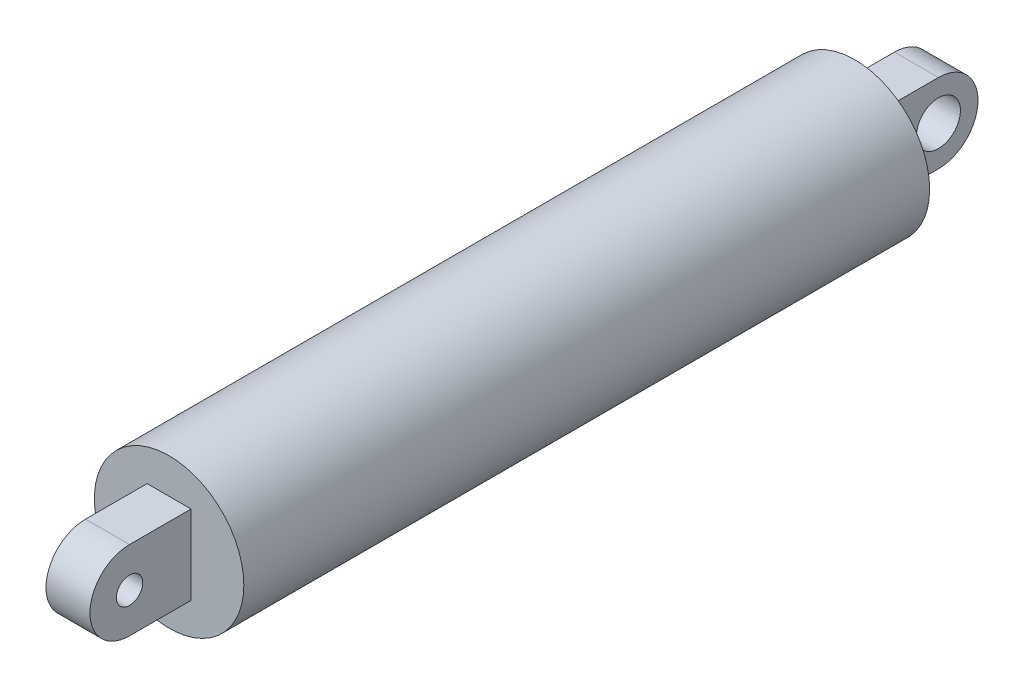
ISO-10303-21;
HEADER;
FILE_DESCRIPTION(('STEP AP214'),'2;1');
FILE_NAME('part.step','',(''),(''),'','','');
FILE_SCHEMA(('AUTOMOTIVE_DESIGN { 1 0 10303 214 1 1 1 1 }'));
ENDSEC;
DATA;
#1=APPLICATION_CONTEXT('core data for automotive mechanical design processes');
#2=APPLICATION_PROTOCOL_DEFINITION('international standard','automotive_design',2000,#1);
#3=PRODUCT_CONTEXT('',#1,'mechanical');
#4=PRODUCT('Part','Part','',(#3));
#5=PRODUCT_RELATED_PRODUCT_CATEGORY('part','',(#4));
#6=PRODUCT_DEFINITION_FORMATION('','',#4);
#7=PRODUCT_DEFINITION_CONTEXT('part definition',#1,'design');
#8=PRODUCT_DEFINITION('design','',#6,#7);
#9=PRODUCT_DEFINITION_SHAPE('','',#8);
#10=(LENGTH_UNIT() NAMED_UNIT(*) SI_UNIT(.MILLI.,.METRE.));
#11=(NAMED_UNIT(*) PLANE_ANGLE_UNIT() SI_UNIT($,.RADIAN.));
#12=(NAMED_UNIT(*) SI_UNIT($,.STERADIAN.) SOLID_ANGLE_UNIT());
#13=UNCERTAINTY_MEASURE_WITH_UNIT(LENGTH_MEASURE(1.E-05),#10,'distance_accuracy_value','');
#14=(GEOMETRIC_REPRESENTATION_CONTEXT(3) GLOBAL_UNCERTAINTY_ASSIGNED_CONTEXT((#13)) GLOBAL_UNIT_ASSIGNED_CONTEXT((#10,
#11,#12)) REPRESENTATION_CONTEXT('',''));
#15=CARTESIAN_POINT('',(0.,0.,0.));
#16=DIRECTION('',(0.,0.,1.));
#17=DIRECTION('',(1.,0.,0.));
#18=AXIS2_PLACEMENT_3D('',#15,#16,#17);
#19=CARTESIAN_POINT('',(0.,0.,0.));
#20=DIRECTION('',(0.,0.,-1.));
#21=DIRECTION('',(-1.,0.,0.));
#22=AXIS2_PLACEMENT_3D('',#19,#20,#21);
#23=PLANE('',#22);
#24=DIRECTION('',(-1.,0.,0.));
#25=VECTOR('',#24,1.);
#26=CARTESIAN_POINT('',(2.5,-4.5,0.));
#27=LINE('',#26,#25);
#28=CARTESIAN_POINT('',(2.5,-4.5,0.));
#29=VERTEX_POINT('',#28);
#30=CARTESIAN_POINT('',(-2.5,-4.5,0.));
#31=VERTEX_POINT('',#30);
#32=EDGE_CURVE('E181',#29,#31,#27,.T.);
#33=ORIENTED_EDGE('',*,*,#32,.T.);
#34=DIRECTION('',(0.,1.,0.));
#35=VECTOR('',#34,1.);
#36=CARTESIAN_POINT('',(-2.5,4.5,0.));
#37=LINE('',#36,#35);
#38=CARTESIAN_POINT('',(-2.5,4.5,0.));
#39=VERTEX_POINT('',#38);
#40=EDGE_CURVE('E62',#31,#39,#37,.T.);
#41=ORIENTED_EDGE('',*,*,#40,.T.);
#42=DIRECTION('',(-1.,0.,0.));
#43=VECTOR('',#42,1.);
#44=CARTESIAN_POINT('',(2.5,4.5,0.));
#45=LINE('',#44,#43);
#46=CARTESIAN_POINT('',(2.5,4.5,0.));
#47=VERTEX_POINT('',#46);
#48=EDGE_CURVE('E178',#47,#39,#45,.T.);
#49=ORIENTED_EDGE('',*,*,#48,.F.);
#50=DIRECTION('',(0.,1.,0.));
#51=VECTOR('',#50,1.);
#52=CARTESIAN_POINT('',(2.5,4.5,0.));
#53=LINE('',#52,#51);
#54=EDGE_CURVE('E158',#29,#47,#53,.T.);
#55=ORIENTED_EDGE('',*,*,#54,.F.);
#56=EDGE_LOOP('',(#33,#41,#49,#55));
#57=FACE_BOUND('',#56,.T.);
#58=CARTESIAN_POINT('',(0.,0.,0.));
#59=DIRECTION('',(0.,0.,1.));
#60=DIRECTION('',(1.,0.,0.));
#61=AXIS2_PLACEMENT_3D('',#58,#59,#60);
#62=CIRCLE('',#61,8.5);
#63=CARTESIAN_POINT('',(8.5,0.,0.));
#64=VERTEX_POINT('',#63);
#65=EDGE_CURVE('E11',#64,#64,#62,.T.);
#66=ORIENTED_EDGE('',*,*,#65,.T.);
#67=EDGE_LOOP('',(#66));
#68=FACE_BOUND('',#67,.T.);
#69=ADVANCED_FACE('F39',(#57,#68),#23,.F.);
#70=CARTESIAN_POINT('',(0.,0.,27.6694587725101));
#71=DIRECTION('',(0.,0.,1.));
#72=DIRECTION('',(1.,0.,0.));
#73=AXIS2_PLACEMENT_3D('',#70,#71,#72);
#74=CYLINDRICAL_SURFACE('',#73,8.5);
#75=ORIENTED_EDGE('',*,*,#65,.F.);
#76=EDGE_LOOP('',(#75));
#77=FACE_BOUND('',#76,.T.);
#78=CARTESIAN_POINT('',(0.,0.,-78.));
#79=DIRECTION('',(0.,0.,1.));
#80=DIRECTION('',(1.,0.,0.));
#81=AXIS2_PLACEMENT_3D('',#78,#79,#80);
#82=CIRCLE('',#81,8.5);
#83=CARTESIAN_POINT('',(8.5,0.,-78.));
#84=VERTEX_POINT('',#83);
#85=EDGE_CURVE('E47',#84,#84,#82,.T.);
#86=ORIENTED_EDGE('',*,*,#85,.T.);
#87=EDGE_LOOP('',(#86));
#88=FACE_BOUND('',#87,.T.);
#89=ADVANCED_FACE('F192',(#77,#88),#74,.T.);
#90=CARTESIAN_POINT('',(0.,8.5,-78.));
#91=DIRECTION('',(0.,0.,1.));
#92=DIRECTION('',(1.,0.,0.));
#93=AXIS2_PLACEMENT_3D('',#90,#91,#92);
#94=PLANE('',#93);
#95=DIRECTION('',(-1.,0.,0.));
#96=VECTOR('',#95,1.);
#97=CARTESIAN_POINT('',(2.5,4.5,-78.));
#98=LINE('',#97,#96);
#99=CARTESIAN_POINT('',(2.5,4.5,-78.));
#100=VERTEX_POINT('',#99);
#101=CARTESIAN_POINT('',(-2.5,4.5,-78.));
#102=VERTEX_POINT('',#101);
#103=EDGE_CURVE('E113',#100,#102,#98,.T.);
#104=ORIENTED_EDGE('',*,*,#103,.T.);
#105=DIRECTION('',(0.,-1.,0.));
#106=VECTOR('',#105,1.);
#107=CARTESIAN_POINT('',(-2.5,4.5,-78.));
#108=LINE('',#107,#106);
#109=CARTESIAN_POINT('',(-2.5,-4.5,-78.));
#110=VERTEX_POINT('',#109);
#111=EDGE_CURVE('E54',#102,#110,#108,.T.);
#112=ORIENTED_EDGE('',*,*,#111,.T.);
#113=DIRECTION('',(-1.,0.,0.));
#114=VECTOR('',#113,1.);
#115=CARTESIAN_POINT('',(2.5,-4.5,-78.));
#116=LINE('',#115,#114);
#117=CARTESIAN_POINT('',(2.5,-4.5,-78.));
#118=VERTEX_POINT('',#117);
#119=EDGE_CURVE('E142',#118,#110,#116,.T.);
#120=ORIENTED_EDGE('',*,*,#119,.F.);
#121=DIRECTION('',(0.,-1.,0.));
#122=VECTOR('',#121,1.);
#123=CARTESIAN_POINT('',(2.5,4.5,-78.));
#124=LINE('',#123,#122);
#125=EDGE_CURVE('E117',#100,#118,#124,.T.);
#126=ORIENTED_EDGE('',*,*,#125,.F.);
#127=EDGE_LOOP('',(#104,#112,#120,#126));
#128=FACE_BOUND('',#127,.T.);
#129=ORIENTED_EDGE('',*,*,#85,.F.);
#130=EDGE_LOOP('',(#129));
#131=FACE_BOUND('',#130,.T.);
#132=ADVANCED_FACE('F194',(#128,#131),#94,.F.);
#133=CARTESIAN_POINT('',(2.5,0.,7.));
#134=DIRECTION('',(1.,0.,0.));
#135=DIRECTION('',(0.,0.,-1.));
#136=AXIS2_PLACEMENT_3D('',#133,#134,#135);
#137=PLANE('',#136);
#138=CARTESIAN_POINT('',(2.5,0.,7.));
#139=DIRECTION('',(1.,0.,0.));
#140=DIRECTION('',(0.,0.,-1.));
#141=AXIS2_PLACEMENT_3D('',#138,#139,#140);
#142=CIRCLE('',#141,4.5);
#143=CARTESIAN_POINT('',(2.5,4.5,7.));
#144=VERTEX_POINT('',#143);
#145=CARTESIAN_POINT('',(2.5,-4.5,7.));
#146=VERTEX_POINT('',#145);
#147=EDGE_CURVE('E150',#144,#146,#142,.T.);
#148=ORIENTED_EDGE('',*,*,#147,.T.);
#149=DIRECTION('',(0.,0.,-1.));
#150=VECTOR('',#149,1.);
#151=CARTESIAN_POINT('',(2.5,-4.5,7.));
#152=LINE('',#151,#150);
#153=EDGE_CURVE('E154',#146,#29,#152,.T.);
#154=ORIENTED_EDGE('',*,*,#153,.T.);
#155=ORIENTED_EDGE('',*,*,#54,.T.);
#156=DIRECTION('',(0.,0.,1.));
#157=VECTOR('',#156,1.);
#158=CARTESIAN_POINT('',(2.5,4.5,7.));
#159=LINE('',#158,#157);
#160=EDGE_CURVE('E161',#47,#144,#159,.T.);
#161=ORIENTED_EDGE('',*,*,#160,.T.);
#162=EDGE_LOOP('',(#148,#154,#155,#161));
#163=FACE_BOUND('',#162,.T.);
#164=CARTESIAN_POINT('',(2.5,0.,7.));
#165=DIRECTION('',(1.,0.,0.));
#166=DIRECTION('',(0.,0.,-1.));
#167=AXIS2_PLACEMENT_3D('',#164,#165,#166);
#168=CIRCLE('',#167,1.5);
#169=CARTESIAN_POINT('',(2.5,0.,5.5));
#170=VERTEX_POINT('',#169);
#171=EDGE_CURVE('E140',#170,#170,#168,.T.);
#172=ORIENTED_EDGE('',*,*,#171,.F.);
#173=EDGE_LOOP('',(#172));
#174=FACE_BOUND('',#173,.T.);
#175=ADVANCED_FACE('F196',(#163,#174),#137,.T.);
#176=CARTESIAN_POINT('',(-2.5,0.,7.));
#177=DIRECTION('',(1.,0.,0.));
#178=DIRECTION('',(0.,0.,-1.));
#179=AXIS2_PLACEMENT_3D('',#176,#177,#178);
#180=PLANE('',#179);
#181=CARTESIAN_POINT('',(-2.5,0.,7.));
#182=DIRECTION('',(1.,0.,0.));
#183=DIRECTION('',(0.,0.,-1.));
#184=AXIS2_PLACEMENT_3D('',#181,#182,#183);
#185=CIRCLE('',#184,4.5);
#186=CARTESIAN_POINT('',(-2.5,4.5,7.));
#187=VERTEX_POINT('',#186);
#188=CARTESIAN_POINT('',(-2.5,-4.5,7.));
#189=VERTEX_POINT('',#188);
#190=EDGE_CURVE('E148',#187,#189,#185,.T.);
#191=ORIENTED_EDGE('',*,*,#190,.F.);
#192=DIRECTION('',(0.,0.,1.));
#193=VECTOR('',#192,1.);
#194=CARTESIAN_POINT('',(-2.5,4.5,7.));
#195=LINE('',#194,#193);
#196=EDGE_CURVE('E155',#39,#187,#195,.T.);
#197=ORIENTED_EDGE('',*,*,#196,.F.);
#198=ORIENTED_EDGE('',*,*,#40,.F.);
#199=DIRECTION('',(0.,0.,-1.));
#200=VECTOR('',#199,1.);
#201=CARTESIAN_POINT('',(-2.5,-4.5,7.));
#202=LINE('',#201,#200);
#203=EDGE_CURVE('E168',#189,#31,#202,.T.);
#204=ORIENTED_EDGE('',*,*,#203,.F.);
#205=EDGE_LOOP('',(#191,#197,#198,#204));
#206=FACE_BOUND('',#205,.T.);
#207=CARTESIAN_POINT('',(-2.5,0.,7.));
#208=DIRECTION('',(1.,0.,0.));
#209=DIRECTION('',(0.,0.,-1.));
#210=AXIS2_PLACEMENT_3D('',#207,#208,#209);
#211=CIRCLE('',#210,1.5);
#212=CARTESIAN_POINT('',(-2.5,0.,5.5));
#213=VERTEX_POINT('',#212);
#214=EDGE_CURVE('E135',#213,#213,#211,.T.);
#215=ORIENTED_EDGE('',*,*,#214,.T.);
#216=EDGE_LOOP('',(#215));
#217=FACE_BOUND('',#216,.T.);
#218=ADVANCED_FACE('F203',(#206,#217),#180,.F.);
#219=CARTESIAN_POINT('',(2.5,0.,7.));
#220=DIRECTION('',(-1.,0.,0.));
#221=DIRECTION('',(0.,0.,1.));
#222=AXIS2_PLACEMENT_3D('',#219,#220,#221);
#223=CYLINDRICAL_SURFACE('',#222,4.5);
#224=ORIENTED_EDGE('',*,*,#190,.T.);
#225=DIRECTION('',(-1.,0.,0.));
#226=VECTOR('',#225,1.);
#227=CARTESIAN_POINT('',(2.5,-4.5,7.));
#228=LINE('',#227,#226);
#229=EDGE_CURVE('E185',#146,#189,#228,.T.);
#230=ORIENTED_EDGE('',*,*,#229,.F.);
#231=ORIENTED_EDGE('',*,*,#147,.F.);
#232=DIRECTION('',(-1.,0.,0.));
#233=VECTOR('',#232,1.);
#234=CARTESIAN_POINT('',(2.5,4.5,7.));
#235=LINE('',#234,#233);
#236=EDGE_CURVE('E164',#144,#187,#235,.T.);
#237=ORIENTED_EDGE('',*,*,#236,.T.);
#238=EDGE_LOOP('',(#224,#230,#231,#237));
#239=FACE_BOUND('',#238,.T.);
#240=ADVANCED_FACE('F223',(#239),#223,.T.);
#241=CARTESIAN_POINT('',(2.5,-4.5,7.));
#242=DIRECTION('',(0.,1.,0.));
#243=DIRECTION('',(0.,0.,1.));
#244=AXIS2_PLACEMENT_3D('',#241,#242,#243);
#245=PLANE('',#244);
#246=ORIENTED_EDGE('',*,*,#203,.T.);
#247=ORIENTED_EDGE('',*,*,#32,.F.);
#248=ORIENTED_EDGE('',*,*,#153,.F.);
#249=ORIENTED_EDGE('',*,*,#229,.T.);
#250=EDGE_LOOP('',(#246,#247,#248,#249));
#251=FACE_BOUND('',#250,.T.);
#252=ADVANCED_FACE('F218',(#251),#245,.F.);
#253=CARTESIAN_POINT('',(2.5,4.5,7.));
#254=DIRECTION('',(0.,-1.,0.));
#255=DIRECTION('',(0.,0.,-1.));
#256=AXIS2_PLACEMENT_3D('',#253,#254,#255);
#257=PLANE('',#256);
#258=ORIENTED_EDGE('',*,*,#196,.T.);
#259=ORIENTED_EDGE('',*,*,#236,.F.);
#260=ORIENTED_EDGE('',*,*,#160,.F.);
#261=ORIENTED_EDGE('',*,*,#48,.T.);
#262=EDGE_LOOP('',(#258,#259,#260,#261));
#263=FACE_BOUND('',#262,.T.);
#264=ADVANCED_FACE('F228',(#263),#257,.F.);
#265=CARTESIAN_POINT('',(2.5,0.,7.));
#266=DIRECTION('',(-1.,0.,0.));
#267=DIRECTION('',(0.,0.,1.));
#268=AXIS2_PLACEMENT_3D('',#265,#266,#267);
#269=CYLINDRICAL_SURFACE('',#268,1.5);
#270=ORIENTED_EDGE('',*,*,#171,.T.);
#271=EDGE_LOOP('',(#270));
#272=FACE_BOUND('',#271,.T.);
#273=ORIENTED_EDGE('',*,*,#214,.F.);
#274=EDGE_LOOP('',(#273));
#275=FACE_BOUND('',#274,.T.);
#276=ADVANCED_FACE('F232',(#272,#275),#269,.F.);
#277=CARTESIAN_POINT('',(2.5,0.,-85.));
#278=DIRECTION('',(1.,0.,0.));
#279=DIRECTION('',(0.,0.,-1.));
#280=AXIS2_PLACEMENT_3D('',#277,#278,#279);
#281=PLANE('',#280);
#282=CARTESIAN_POINT('',(2.5,0.,-85.));
#283=DIRECTION('',(1.,0.,0.));
#284=DIRECTION('',(0.,0.,-1.));
#285=AXIS2_PLACEMENT_3D('',#282,#283,#284);
#286=CIRCLE('',#285,4.5);
#287=CARTESIAN_POINT('',(2.5,-4.5,-85.));
#288=VERTEX_POINT('',#287);
#289=CARTESIAN_POINT('',(2.5,4.5,-85.));
#290=VERTEX_POINT('',#289);
#291=EDGE_CURVE('E118',#288,#290,#286,.T.);
#292=ORIENTED_EDGE('',*,*,#291,.T.);
#293=DIRECTION('',(0.,0.,1.));
#294=VECTOR('',#293,1.);
#295=CARTESIAN_POINT('',(2.5,4.5,-85.));
#296=LINE('',#295,#294);
#297=EDGE_CURVE('E106',#290,#100,#296,.T.);
#298=ORIENTED_EDGE('',*,*,#297,.T.);
#299=ORIENTED_EDGE('',*,*,#125,.T.);
#300=DIRECTION('',(0.,0.,-1.));
#301=VECTOR('',#300,1.);
#302=CARTESIAN_POINT('',(2.5,-4.5,-85.));
#303=LINE('',#302,#301);
#304=EDGE_CURVE('E124',#118,#288,#303,.T.);
#305=ORIENTED_EDGE('',*,*,#304,.T.);
#306=EDGE_LOOP('',(#292,#298,#299,#305));
#307=FACE_BOUND('',#306,.T.);
#308=CARTESIAN_POINT('',(2.5,0.,-85.));
#309=DIRECTION('',(1.,0.,0.));
#310=DIRECTION('',(0.,0.,-1.));
#311=AXIS2_PLACEMENT_3D('',#308,#309,#310);
#312=CIRCLE('',#311,2.5);
#313=CARTESIAN_POINT('',(2.5,0.,-87.5));
#314=VERTEX_POINT('',#313);
#315=EDGE_CURVE('E350',#314,#314,#312,.T.);
#316=ORIENTED_EDGE('',*,*,#315,.F.);
#317=EDGE_LOOP('',(#316));
#318=FACE_BOUND('',#317,.T.);
#319=ADVANCED_FACE('F121',(#307,#318),#281,.T.);
#320=CARTESIAN_POINT('',(-2.5,0.,-85.));
#321=DIRECTION('',(1.,0.,0.));
#322=DIRECTION('',(0.,0.,-1.));
#323=AXIS2_PLACEMENT_3D('',#320,#321,#322);
#324=PLANE('',#323);
#325=CARTESIAN_POINT('',(-2.5,0.,-85.));
#326=DIRECTION('',(1.,0.,0.));
#327=DIRECTION('',(0.,0.,-1.));
#328=AXIS2_PLACEMENT_3D('',#325,#326,#327);
#329=CIRCLE('',#328,4.5);
#330=CARTESIAN_POINT('',(-2.5,-4.5,-85.));
#331=VERTEX_POINT('',#330);
#332=CARTESIAN_POINT('',(-2.5,4.5,-85.));
#333=VERTEX_POINT('',#332);
#334=EDGE_CURVE('E133',#331,#333,#329,.T.);
#335=ORIENTED_EDGE('',*,*,#334,.F.);
#336=DIRECTION('',(0.,0.,-1.));
#337=VECTOR('',#336,1.);
#338=CARTESIAN_POINT('',(-2.5,-4.5,-85.));
#339=LINE('',#338,#337);
#340=EDGE_CURVE('E129',#110,#331,#339,.T.);
#341=ORIENTED_EDGE('',*,*,#340,.F.);
#342=ORIENTED_EDGE('',*,*,#111,.F.);
#343=DIRECTION('',(0.,0.,1.));
#344=VECTOR('',#343,1.);
#345=CARTESIAN_POINT('',(-2.5,4.5,-85.));
#346=LINE('',#345,#344);
#347=EDGE_CURVE('E367',#333,#102,#346,.T.);
#348=ORIENTED_EDGE('',*,*,#347,.F.);
#349=EDGE_LOOP('',(#335,#341,#342,#348));
#350=FACE_BOUND('',#349,.T.);
#351=CARTESIAN_POINT('',(-2.5,0.,-85.));
#352=DIRECTION('',(1.,0.,0.));
#353=DIRECTION('',(0.,0.,-1.));
#354=AXIS2_PLACEMENT_3D('',#351,#352,#353);
#355=CIRCLE('',#354,2.5);
#356=CARTESIAN_POINT('',(-2.5,0.,-87.5));
#357=VERTEX_POINT('',#356);
#358=EDGE_CURVE('E353',#357,#357,#355,.T.);
#359=ORIENTED_EDGE('',*,*,#358,.T.);
#360=EDGE_LOOP('',(#359));
#361=FACE_BOUND('',#360,.T.);
#362=ADVANCED_FACE('F264',(#350,#361),#324,.F.);
#363=CARTESIAN_POINT('',(2.5,0.,-85.));
#364=DIRECTION('',(-1.,0.,0.));
#365=DIRECTION('',(0.,0.,1.));
#366=AXIS2_PLACEMENT_3D('',#363,#364,#365);
#367=CYLINDRICAL_SURFACE('',#366,4.5);
#368=ORIENTED_EDGE('',*,*,#334,.T.);
#369=DIRECTION('',(-1.,0.,0.));
#370=VECTOR('',#369,1.);
#371=CARTESIAN_POINT('',(2.5,4.5,-85.));
#372=LINE('',#371,#370);
#373=EDGE_CURVE('E110',#290,#333,#372,.T.);
#374=ORIENTED_EDGE('',*,*,#373,.F.);
#375=ORIENTED_EDGE('',*,*,#291,.F.);
#376=DIRECTION('',(-1.,0.,0.));
#377=VECTOR('',#376,1.);
#378=CARTESIAN_POINT('',(2.5,-4.5,-85.));
#379=LINE('',#378,#377);
#380=EDGE_CURVE('E364',#288,#331,#379,.T.);
#381=ORIENTED_EDGE('',*,*,#380,.T.);
#382=EDGE_LOOP('',(#368,#374,#375,#381));
#383=FACE_BOUND('',#382,.T.);
#384=ADVANCED_FACE('F131',(#383),#367,.T.);
#385=CARTESIAN_POINT('',(2.5,4.5,-85.));
#386=DIRECTION('',(0.,-1.,0.));
#387=DIRECTION('',(0.,0.,-1.));
#388=AXIS2_PLACEMENT_3D('',#385,#386,#387);
#389=PLANE('',#388);
#390=ORIENTED_EDGE('',*,*,#347,.T.);
#391=ORIENTED_EDGE('',*,*,#103,.F.);
#392=ORIENTED_EDGE('',*,*,#297,.F.);
#393=ORIENTED_EDGE('',*,*,#373,.T.);
#394=EDGE_LOOP('',(#390,#391,#392,#393));
#395=FACE_BOUND('',#394,.T.);
#396=ADVANCED_FACE('F108',(#395),#389,.F.);
#397=CARTESIAN_POINT('',(2.5,-4.5,-85.));
#398=DIRECTION('',(0.,1.,0.));
#399=DIRECTION('',(0.,0.,1.));
#400=AXIS2_PLACEMENT_3D('',#397,#398,#399);
#401=PLANE('',#400);
#402=ORIENTED_EDGE('',*,*,#340,.T.);
#403=ORIENTED_EDGE('',*,*,#380,.F.);
#404=ORIENTED_EDGE('',*,*,#304,.F.);
#405=ORIENTED_EDGE('',*,*,#119,.T.);
#406=EDGE_LOOP('',(#402,#403,#404,#405));
#407=FACE_BOUND('',#406,.T.);
#408=ADVANCED_FACE('F283',(#407),#401,.F.);
#409=CARTESIAN_POINT('',(2.5,0.,-85.));
#410=DIRECTION('',(-1.,0.,0.));
#411=DIRECTION('',(0.,0.,1.));
#412=AXIS2_PLACEMENT_3D('',#409,#410,#411);
#413=CYLINDRICAL_SURFACE('',#412,2.5);
#414=ORIENTED_EDGE('',*,*,#315,.T.);
#415=EDGE_LOOP('',(#414));
#416=FACE_BOUND('',#415,.T.);
#417=ORIENTED_EDGE('',*,*,#358,.F.);
#418=EDGE_LOOP('',(#417));
#419=FACE_BOUND('',#418,.T.);
#420=ADVANCED_FACE('F290',(#416,#419),#413,.F.);
#421=CLOSED_SHELL('',(#69,#89,#132,#175,#218,#240,#252,#264,#276,#319,#362,#384,#396,#408,#420));
#422=MANIFOLD_SOLID_BREP('B2',#421);
#423=ADVANCED_BREP_SHAPE_REPRESENTATION('',(#18,#422),#14);
#424=SHAPE_DEFINITION_REPRESENTATION(#9,#423);
ENDSEC;
END-ISO-10303-21;
